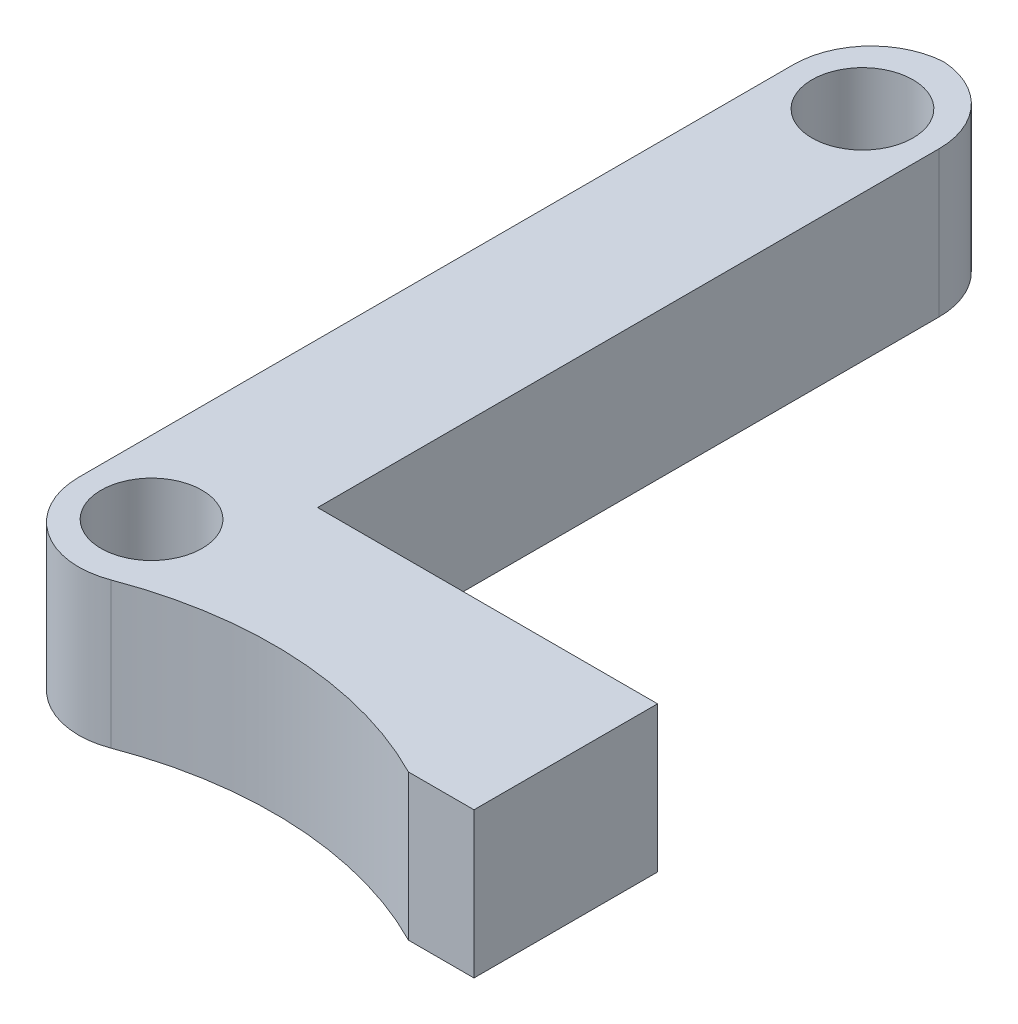
ISO-10303-21;
HEADER;
FILE_DESCRIPTION(('STEP AP214'),'2;1');
FILE_NAME('part.step','',(''),(''),'','','');
FILE_SCHEMA(('AUTOMOTIVE_DESIGN { 1 0 10303 214 1 1 1 1 }'));
ENDSEC;
DATA;
#1=APPLICATION_CONTEXT('core data for automotive mechanical design processes');
#2=APPLICATION_PROTOCOL_DEFINITION('international standard','automotive_design',2000,#1);
#3=PRODUCT_CONTEXT('',#1,'mechanical');
#4=PRODUCT('Part','Part','',(#3));
#5=PRODUCT_RELATED_PRODUCT_CATEGORY('part','',(#4));
#6=PRODUCT_DEFINITION_FORMATION('','',#4);
#7=PRODUCT_DEFINITION_CONTEXT('part definition',#1,'design');
#8=PRODUCT_DEFINITION('design','',#6,#7);
#9=PRODUCT_DEFINITION_SHAPE('','',#8);
#10=(LENGTH_UNIT() NAMED_UNIT(*) SI_UNIT(.MILLI.,.METRE.));
#11=(NAMED_UNIT(*) PLANE_ANGLE_UNIT() SI_UNIT($,.RADIAN.));
#12=(NAMED_UNIT(*) SI_UNIT($,.STERADIAN.) SOLID_ANGLE_UNIT());
#13=UNCERTAINTY_MEASURE_WITH_UNIT(LENGTH_MEASURE(1.E-05),#10,'distance_accuracy_value','');
#14=(GEOMETRIC_REPRESENTATION_CONTEXT(3) GLOBAL_UNCERTAINTY_ASSIGNED_CONTEXT((#13)) GLOBAL_UNIT_ASSIGNED_CONTEXT((#10,
#11,#12)) REPRESENTATION_CONTEXT('',''));
#15=CARTESIAN_POINT('',(0.,0.,0.));
#16=DIRECTION('',(0.,0.,1.));
#17=DIRECTION('',(1.,0.,0.));
#18=AXIS2_PLACEMENT_3D('',#15,#16,#17);
#19=CARTESIAN_POINT('',(11.1125,9.525,51.7475692889851));
#20=DIRECTION('',(0.,-1.,0.));
#21=DIRECTION('',(0.,0.,-1.));
#22=AXIS2_PLACEMENT_3D('',#19,#20,#21);
#23=PLANE('',#22);
#24=DIRECTION('',(0.,0.,1.));
#25=VECTOR('',#24,1.);
#26=CARTESIAN_POINT('',(-4.7625,9.525,-28.575));
#27=LINE('',#26,#25);
#28=CARTESIAN_POINT('',(-4.7625,9.525,-23.495));
#29=VERTEX_POINT('',#28);
#30=CARTESIAN_POINT('',(-4.7625,9.525,23.2432121659066));
#31=VERTEX_POINT('',#30);
#32=EDGE_CURVE('E123',#29,#31,#27,.T.);
#33=ORIENTED_EDGE('',*,*,#32,.T.);
#34=CARTESIAN_POINT('',(0.317500000000007,9.525,23.2432121659066));
#35=DIRECTION('',(0.,-1.,0.));
#36=DIRECTION('',(0.,0.,-1.));
#37=AXIS2_PLACEMENT_3D('',#34,#35,#36);
#38=CIRCLE('',#37,5.08);
#39=CARTESIAN_POINT('',(2.11666666666666,9.525,27.9939383530863));
#40=VERTEX_POINT('',#39);
#41=EDGE_CURVE('E11',#31,#40,#38,.F.);
#42=ORIENTED_EDGE('',*,*,#41,.T.);
#43=CARTESIAN_POINT('',(11.1125,9.525,51.7475692889851));
#44=DIRECTION('',(0.,-1.,0.));
#45=DIRECTION('',(0.,0.,-1.));
#46=AXIS2_PLACEMENT_3D('',#43,#44,#45);
#47=CIRCLE('',#46,25.4);
#48=CARTESIAN_POINT('',(22.7035166506002,9.525,29.1465));
#49=VERTEX_POINT('',#48);
#50=EDGE_CURVE('E182',#40,#49,#47,.T.);
#51=ORIENTED_EDGE('',*,*,#50,.T.);
#52=DIRECTION('',(1.,0.,0.));
#53=VECTOR('',#52,1.);
#54=CARTESIAN_POINT('',(26.9875,9.525,29.1465));
#55=LINE('',#54,#53);
#56=CARTESIAN_POINT('',(26.9875,9.525,29.1465));
#57=VERTEX_POINT('',#56);
#58=EDGE_CURVE('E222',#49,#57,#55,.T.);
#59=ORIENTED_EDGE('',*,*,#58,.T.);
#60=DIRECTION('',(0.,0.,-1.));
#61=VECTOR('',#60,1.);
#62=CARTESIAN_POINT('',(26.9875,9.525,17.145));
#63=LINE('',#62,#61);
#64=CARTESIAN_POINT('',(26.9875,9.525,17.145));
#65=VERTEX_POINT('',#64);
#66=EDGE_CURVE('E129',#57,#65,#63,.T.);
#67=ORIENTED_EDGE('',*,*,#66,.T.);
#68=DIRECTION('',(-1.,0.,0.));
#69=VECTOR('',#68,1.);
#70=CARTESIAN_POINT('',(4.76250000000001,9.525,17.145));
#71=LINE('',#70,#69);
#72=CARTESIAN_POINT('',(4.76250000000001,9.525,17.145));
#73=VERTEX_POINT('',#72);
#74=EDGE_CURVE('E124',#65,#73,#71,.T.);
#75=ORIENTED_EDGE('',*,*,#74,.T.);
#76=DIRECTION('',(0.,0.,-1.));
#77=VECTOR('',#76,1.);
#78=CARTESIAN_POINT('',(4.7625,9.525,-28.575));
#79=LINE('',#78,#77);
#80=CARTESIAN_POINT('',(4.7625,9.525,-23.495));
#81=VERTEX_POINT('',#80);
#82=EDGE_CURVE('E112',#73,#81,#79,.T.);
#83=ORIENTED_EDGE('',*,*,#82,.T.);
#84=CARTESIAN_POINT('',(-0.3175,9.525,-23.495));
#85=DIRECTION('',(0.,-1.,0.));
#86=DIRECTION('',(0.,0.,-1.));
#87=AXIS2_PLACEMENT_3D('',#84,#85,#86);
#88=CIRCLE('',#87,5.08);
#89=CARTESIAN_POINT('',(0.,9.525,-28.5650684166981));
#90=VERTEX_POINT('',#89);
#91=EDGE_CURVE('E159',#81,#90,#88,.F.);
#92=ORIENTED_EDGE('',*,*,#91,.T.);
#93=CARTESIAN_POINT('',(0.317499999999997,9.525,-23.495));
#94=DIRECTION('',(0.,-1.,0.));
#95=DIRECTION('',(0.,0.,-1.));
#96=AXIS2_PLACEMENT_3D('',#93,#94,#95);
#97=CIRCLE('',#96,5.08);
#98=EDGE_CURVE('E156',#90,#29,#97,.F.);
#99=ORIENTED_EDGE('',*,*,#98,.T.);
#100=EDGE_LOOP('',(#33,#42,#51,#59,#67,#75,#83,#92,#99));
#101=FACE_BOUND('',#100,.T.);
#102=CARTESIAN_POINT('',(0.,9.525,23.241));
#103=DIRECTION('',(0.,1.,0.));
#104=DIRECTION('',(0.,0.,1.));
#105=AXIS2_PLACEMENT_3D('',#102,#103,#104);
#106=CIRCLE('',#105,3.302);
#107=CARTESIAN_POINT('',(0.,9.525,19.939));
#108=VERTEX_POINT('',#107);
#109=EDGE_CURVE('E212',#108,#108,#106,.T.);
#110=ORIENTED_EDGE('',*,*,#109,.F.);
#111=EDGE_LOOP('',(#110));
#112=FACE_BOUND('',#111,.T.);
#113=CARTESIAN_POINT('',(0.,9.525,-23.241));
#114=DIRECTION('',(0.,1.,0.));
#115=DIRECTION('',(0.,0.,1.));
#116=AXIS2_PLACEMENT_3D('',#113,#114,#115);
#117=CIRCLE('',#116,3.302);
#118=CARTESIAN_POINT('',(0.,9.525,-26.543));
#119=VERTEX_POINT('',#118);
#120=EDGE_CURVE('E231',#119,#119,#117,.T.);
#121=ORIENTED_EDGE('',*,*,#120,.F.);
#122=EDGE_LOOP('',(#121));
#123=FACE_BOUND('',#122,.T.);
#124=ADVANCED_FACE('F39',(#101,#112,#123),#23,.F.);
#125=CARTESIAN_POINT('',(11.1125,0.,51.7475692889851));
#126=DIRECTION('',(0.,-1.,0.));
#127=DIRECTION('',(0.,0.,-1.));
#128=AXIS2_PLACEMENT_3D('',#125,#126,#127);
#129=PLANE('',#128);
#130=CARTESIAN_POINT('',(0.,0.,23.241));
#131=DIRECTION('',(0.,1.,0.));
#132=DIRECTION('',(0.,0.,1.));
#133=AXIS2_PLACEMENT_3D('',#130,#131,#132);
#134=CIRCLE('',#133,3.302);
#135=CARTESIAN_POINT('',(0.,0.,19.939));
#136=VERTEX_POINT('',#135);
#137=EDGE_CURVE('E217',#136,#136,#134,.T.);
#138=ORIENTED_EDGE('',*,*,#137,.T.);
#139=EDGE_LOOP('',(#138));
#140=FACE_BOUND('',#139,.T.);
#141=CARTESIAN_POINT('',(11.1125,0.,51.7475692889851));
#142=DIRECTION('',(0.,-1.,0.));
#143=DIRECTION('',(0.,0.,-1.));
#144=AXIS2_PLACEMENT_3D('',#141,#142,#143);
#145=CIRCLE('',#144,25.4);
#146=CARTESIAN_POINT('',(2.11666666666666,0.,27.9939383530863));
#147=VERTEX_POINT('',#146);
#148=CARTESIAN_POINT('',(22.7035166506002,0.,29.1465));
#149=VERTEX_POINT('',#148);
#150=EDGE_CURVE('E181',#147,#149,#145,.T.);
#151=ORIENTED_EDGE('',*,*,#150,.F.);
#152=CARTESIAN_POINT('',(0.317500000000007,0.,23.2432121659066));
#153=DIRECTION('',(0.,-1.,0.));
#154=DIRECTION('',(0.,0.,-1.));
#155=AXIS2_PLACEMENT_3D('',#152,#153,#154);
#156=CIRCLE('',#155,5.08);
#157=CARTESIAN_POINT('',(-4.7625,0.,23.2432121659066));
#158=VERTEX_POINT('',#157);
#159=EDGE_CURVE('E62',#147,#158,#156,.T.);
#160=ORIENTED_EDGE('',*,*,#159,.T.);
#161=DIRECTION('',(0.,0.,1.));
#162=VECTOR('',#161,1.);
#163=CARTESIAN_POINT('',(-4.7625,0.,-28.575));
#164=LINE('',#163,#162);
#165=CARTESIAN_POINT('',(-4.7625,0.,-23.495));
#166=VERTEX_POINT('',#165);
#167=EDGE_CURVE('E191',#166,#158,#164,.T.);
#168=ORIENTED_EDGE('',*,*,#167,.F.);
#169=CARTESIAN_POINT('',(0.317499999999997,0.,-23.495));
#170=DIRECTION('',(0.,-1.,0.));
#171=DIRECTION('',(0.,0.,-1.));
#172=AXIS2_PLACEMENT_3D('',#169,#170,#171);
#173=CIRCLE('',#172,5.08);
#174=CARTESIAN_POINT('',(0.,0.,-28.5650684166981));
#175=VERTEX_POINT('',#174);
#176=EDGE_CURVE('E140',#166,#175,#173,.T.);
#177=ORIENTED_EDGE('',*,*,#176,.T.);
#178=CARTESIAN_POINT('',(-0.3175,0.,-23.495));
#179=DIRECTION('',(0.,-1.,0.));
#180=DIRECTION('',(0.,0.,-1.));
#181=AXIS2_PLACEMENT_3D('',#178,#179,#180);
#182=CIRCLE('',#181,5.08);
#183=CARTESIAN_POINT('',(4.7625,0.,-23.495));
#184=VERTEX_POINT('',#183);
#185=EDGE_CURVE('E145',#175,#184,#182,.T.);
#186=ORIENTED_EDGE('',*,*,#185,.T.);
#187=DIRECTION('',(0.,0.,-1.));
#188=VECTOR('',#187,1.);
#189=CARTESIAN_POINT('',(4.7625,0.,-28.575));
#190=LINE('',#189,#188);
#191=CARTESIAN_POINT('',(4.76250000000001,0.,17.145));
#192=VERTEX_POINT('',#191);
#193=EDGE_CURVE('E196',#192,#184,#190,.T.);
#194=ORIENTED_EDGE('',*,*,#193,.F.);
#195=DIRECTION('',(-1.,0.,0.));
#196=VECTOR('',#195,1.);
#197=CARTESIAN_POINT('',(4.76250000000001,0.,17.145));
#198=LINE('',#197,#196);
#199=CARTESIAN_POINT('',(26.9875,0.,17.145));
#200=VERTEX_POINT('',#199);
#201=EDGE_CURVE('E138',#200,#192,#198,.T.);
#202=ORIENTED_EDGE('',*,*,#201,.F.);
#203=DIRECTION('',(0.,0.,-1.));
#204=VECTOR('',#203,1.);
#205=CARTESIAN_POINT('',(26.9875,0.,17.145));
#206=LINE('',#205,#204);
#207=CARTESIAN_POINT('',(26.9875,0.,29.1465));
#208=VERTEX_POINT('',#207);
#209=EDGE_CURVE('E134',#208,#200,#206,.T.);
#210=ORIENTED_EDGE('',*,*,#209,.F.);
#211=DIRECTION('',(1.,0.,0.));
#212=VECTOR('',#211,1.);
#213=CARTESIAN_POINT('',(26.9875,0.,29.1465));
#214=LINE('',#213,#212);
#215=EDGE_CURVE('E189',#149,#208,#214,.T.);
#216=ORIENTED_EDGE('',*,*,#215,.F.);
#217=EDGE_LOOP('',(#151,#160,#168,#177,#186,#194,#202,#210,#216));
#218=FACE_BOUND('',#217,.T.);
#219=CARTESIAN_POINT('',(0.,0.,-23.241));
#220=DIRECTION('',(0.,1.,0.));
#221=DIRECTION('',(0.,0.,1.));
#222=AXIS2_PLACEMENT_3D('',#219,#220,#221);
#223=CIRCLE('',#222,3.302);
#224=CARTESIAN_POINT('',(0.,0.,-26.543));
#225=VERTEX_POINT('',#224);
#226=EDGE_CURVE('E170',#225,#225,#223,.T.);
#227=ORIENTED_EDGE('',*,*,#226,.T.);
#228=EDGE_LOOP('',(#227));
#229=FACE_BOUND('',#228,.T.);
#230=ADVANCED_FACE('F186',(#140,#218,#229),#129,.T.);
#231=CARTESIAN_POINT('',(4.76250000000001,9.525,17.145));
#232=DIRECTION('',(0.,0.,1.));
#233=DIRECTION('',(1.,0.,0.));
#234=AXIS2_PLACEMENT_3D('',#231,#232,#233);
#235=PLANE('',#234);
#236=ORIENTED_EDGE('',*,*,#201,.T.);
#237=DIRECTION('',(0.,-1.,0.));
#238=VECTOR('',#237,1.);
#239=CARTESIAN_POINT('',(4.76250000000001,9.525,17.145));
#240=LINE('',#239,#238);
#241=EDGE_CURVE('E117',#73,#192,#240,.T.);
#242=ORIENTED_EDGE('',*,*,#241,.F.);
#243=ORIENTED_EDGE('',*,*,#74,.F.);
#244=DIRECTION('',(0.,-1.,0.));
#245=VECTOR('',#244,1.);
#246=CARTESIAN_POINT('',(26.9875,9.525,17.145));
#247=LINE('',#246,#245);
#248=EDGE_CURVE('E202',#65,#200,#247,.T.);
#249=ORIENTED_EDGE('',*,*,#248,.T.);
#250=EDGE_LOOP('',(#236,#242,#243,#249));
#251=FACE_BOUND('',#250,.T.);
#252=ADVANCED_FACE('F136',(#251),#235,.F.);
#253=CARTESIAN_POINT('',(4.7625,9.525,-28.575));
#254=DIRECTION('',(-1.,0.,0.));
#255=DIRECTION('',(0.,0.,1.));
#256=AXIS2_PLACEMENT_3D('',#253,#254,#255);
#257=PLANE('',#256);
#258=ORIENTED_EDGE('',*,*,#193,.T.);
#259=DIRECTION('',(0.,-1.,0.));
#260=VECTOR('',#259,1.);
#261=CARTESIAN_POINT('',(4.7625,9.525,-23.495));
#262=LINE('',#261,#260);
#263=EDGE_CURVE('E120',#184,#81,#262,.F.);
#264=ORIENTED_EDGE('',*,*,#263,.T.);
#265=ORIENTED_EDGE('',*,*,#82,.F.);
#266=ORIENTED_EDGE('',*,*,#241,.T.);
#267=EDGE_LOOP('',(#258,#264,#265,#266));
#268=FACE_BOUND('',#267,.T.);
#269=ADVANCED_FACE('F115',(#268),#257,.F.);
#270=CARTESIAN_POINT('',(-4.7625,9.525,-28.575));
#271=DIRECTION('',(1.,0.,0.));
#272=DIRECTION('',(0.,0.,-1.));
#273=AXIS2_PLACEMENT_3D('',#270,#271,#272);
#274=PLANE('',#273);
#275=ORIENTED_EDGE('',*,*,#167,.T.);
#276=DIRECTION('',(0.,-1.,0.));
#277=VECTOR('',#276,1.);
#278=CARTESIAN_POINT('',(-4.7625,9.525,23.2432121659066));
#279=LINE('',#278,#277);
#280=EDGE_CURVE('E48',#158,#31,#279,.F.);
#281=ORIENTED_EDGE('',*,*,#280,.T.);
#282=ORIENTED_EDGE('',*,*,#32,.F.);
#283=DIRECTION('',(0.,-1.,0.));
#284=VECTOR('',#283,1.);
#285=CARTESIAN_POINT('',(-4.7625,9.525,-23.495));
#286=LINE('',#285,#284);
#287=EDGE_CURVE('E162',#29,#166,#286,.T.);
#288=ORIENTED_EDGE('',*,*,#287,.T.);
#289=EDGE_LOOP('',(#275,#281,#282,#288));
#290=FACE_BOUND('',#289,.T.);
#291=ADVANCED_FACE('F261',(#290),#274,.F.);
#292=CARTESIAN_POINT('',(11.1125,9.525,51.7475692889851));
#293=DIRECTION('',(0.,-1.,0.));
#294=DIRECTION('',(0.,0.,-1.));
#295=AXIS2_PLACEMENT_3D('',#292,#293,#294);
#296=CYLINDRICAL_SURFACE('',#295,25.4);
#297=ORIENTED_EDGE('',*,*,#50,.F.);
#298=DIRECTION('',(0.,-1.,0.));
#299=VECTOR('',#298,1.);
#300=CARTESIAN_POINT('',(2.11666666666667,9.525,27.9939383530863));
#301=LINE('',#300,#299);
#302=EDGE_CURVE('E165',#40,#147,#301,.T.);
#303=ORIENTED_EDGE('',*,*,#302,.T.);
#304=ORIENTED_EDGE('',*,*,#150,.T.);
#305=DIRECTION('',(0.,-1.,0.));
#306=VECTOR('',#305,1.);
#307=CARTESIAN_POINT('',(22.7035166506002,9.525,29.1465));
#308=LINE('',#307,#306);
#309=EDGE_CURVE('E141',#49,#149,#308,.T.);
#310=ORIENTED_EDGE('',*,*,#309,.F.);
#311=EDGE_LOOP('',(#297,#303,#304,#310));
#312=FACE_BOUND('',#311,.T.);
#313=ADVANCED_FACE('F179',(#312),#296,.F.);
#314=CARTESIAN_POINT('',(26.9875,9.525,29.1465));
#315=DIRECTION('',(0.,0.,-1.));
#316=DIRECTION('',(-1.,0.,0.));
#317=AXIS2_PLACEMENT_3D('',#314,#315,#316);
#318=PLANE('',#317);
#319=ORIENTED_EDGE('',*,*,#215,.T.);
#320=DIRECTION('',(0.,-1.,0.));
#321=VECTOR('',#320,1.);
#322=CARTESIAN_POINT('',(26.9875,9.525,29.1465));
#323=LINE('',#322,#321);
#324=EDGE_CURVE('E148',#57,#208,#323,.T.);
#325=ORIENTED_EDGE('',*,*,#324,.F.);
#326=ORIENTED_EDGE('',*,*,#58,.F.);
#327=ORIENTED_EDGE('',*,*,#309,.T.);
#328=EDGE_LOOP('',(#319,#325,#326,#327));
#329=FACE_BOUND('',#328,.T.);
#330=ADVANCED_FACE('F256',(#329),#318,.F.);
#331=CARTESIAN_POINT('',(26.9875,9.525,17.145));
#332=DIRECTION('',(-1.,0.,0.));
#333=DIRECTION('',(0.,0.,1.));
#334=AXIS2_PLACEMENT_3D('',#331,#332,#333);
#335=PLANE('',#334);
#336=ORIENTED_EDGE('',*,*,#209,.T.);
#337=ORIENTED_EDGE('',*,*,#248,.F.);
#338=ORIENTED_EDGE('',*,*,#66,.F.);
#339=ORIENTED_EDGE('',*,*,#324,.T.);
#340=EDGE_LOOP('',(#336,#337,#338,#339));
#341=FACE_BOUND('',#340,.T.);
#342=ADVANCED_FACE('F208',(#341),#335,.F.);
#343=CARTESIAN_POINT('',(0.,9.525,23.241));
#344=DIRECTION('',(0.,-1.,0.));
#345=DIRECTION('',(0.,0.,-1.));
#346=AXIS2_PLACEMENT_3D('',#343,#344,#345);
#347=CYLINDRICAL_SURFACE('',#346,3.302);
#348=CARTESIAN_POINT('',(0.,9.525,19.939));
#349=CARTESIAN_POINT('',(0.,9.42578125,19.939));
#350=CARTESIAN_POINT('',(0.,9.3265625,19.939));
#351=CARTESIAN_POINT('',(0.,9.128125,19.939));
#352=CARTESIAN_POINT('',(0.,9.02890625,19.939));
#353=CARTESIAN_POINT('',(0.,8.83046875,19.939));
#354=CARTESIAN_POINT('',(0.,8.73125,19.939));
#355=CARTESIAN_POINT('',(0.,8.5328125,19.939));
#356=CARTESIAN_POINT('',(0.,8.43359375,19.939));
#357=CARTESIAN_POINT('',(0.,8.23515625,19.939));
#358=CARTESIAN_POINT('',(0.,8.1359375,19.939));
#359=CARTESIAN_POINT('',(0.,7.9375,19.939));
#360=CARTESIAN_POINT('',(0.,7.83828125,19.939));
#361=CARTESIAN_POINT('',(0.,7.63984375,19.939));
#362=CARTESIAN_POINT('',(0.,7.540625,19.939));
#363=CARTESIAN_POINT('',(0.,7.3421875,19.939));
#364=CARTESIAN_POINT('',(0.,7.24296875,19.939));
#365=CARTESIAN_POINT('',(0.,7.04453125,19.939));
#366=CARTESIAN_POINT('',(0.,6.9453125,19.939));
#367=CARTESIAN_POINT('',(0.,6.746875,19.939));
#368=CARTESIAN_POINT('',(0.,6.64765625,19.939));
#369=CARTESIAN_POINT('',(0.,6.44921875,19.939));
#370=CARTESIAN_POINT('',(0.,6.35,19.939));
#371=CARTESIAN_POINT('',(0.,6.1515625,19.939));
#372=CARTESIAN_POINT('',(0.,6.05234375,19.939));
#373=CARTESIAN_POINT('',(0.,5.85390625,19.939));
#374=CARTESIAN_POINT('',(0.,5.7546875,19.939));
#375=CARTESIAN_POINT('',(0.,5.55625,19.939));
#376=CARTESIAN_POINT('',(0.,5.45703125,19.939));
#377=CARTESIAN_POINT('',(0.,5.25859375,19.939));
#378=CARTESIAN_POINT('',(0.,5.159375,19.939));
#379=CARTESIAN_POINT('',(0.,4.9609375,19.939));
#380=CARTESIAN_POINT('',(0.,4.86171875,19.939));
#381=CARTESIAN_POINT('',(0.,4.66328125,19.939));
#382=CARTESIAN_POINT('',(0.,4.5640625,19.939));
#383=CARTESIAN_POINT('',(0.,4.365625,19.939));
#384=CARTESIAN_POINT('',(0.,4.26640625,19.939));
#385=CARTESIAN_POINT('',(0.,4.06796875,19.939));
#386=CARTESIAN_POINT('',(0.,3.96875,19.939));
#387=CARTESIAN_POINT('',(0.,3.7703125,19.939));
#388=CARTESIAN_POINT('',(0.,3.67109375,19.939));
#389=CARTESIAN_POINT('',(0.,3.47265625,19.939));
#390=CARTESIAN_POINT('',(0.,3.3734375,19.939));
#391=CARTESIAN_POINT('',(0.,3.175,19.939));
#392=CARTESIAN_POINT('',(0.,3.07578125,19.939));
#393=CARTESIAN_POINT('',(0.,2.87734375,19.939));
#394=CARTESIAN_POINT('',(0.,2.778125,19.939));
#395=CARTESIAN_POINT('',(0.,2.5796875,19.939));
#396=CARTESIAN_POINT('',(0.,2.48046875,19.939));
#397=CARTESIAN_POINT('',(0.,2.28203125,19.939));
#398=CARTESIAN_POINT('',(0.,2.1828125,19.939));
#399=CARTESIAN_POINT('',(0.,1.984375,19.939));
#400=CARTESIAN_POINT('',(0.,1.88515625,19.939));
#401=CARTESIAN_POINT('',(0.,1.68671875,19.939));
#402=CARTESIAN_POINT('',(0.,1.5875,19.939));
#403=CARTESIAN_POINT('',(0.,1.3890625,19.939));
#404=CARTESIAN_POINT('',(0.,1.28984375,19.939));
#405=CARTESIAN_POINT('',(0.,1.09140625,19.939));
#406=CARTESIAN_POINT('',(0.,0.992187500000001,19.939));
#407=CARTESIAN_POINT('',(0.,0.793750000000001,19.939));
#408=CARTESIAN_POINT('',(0.,0.69453125,19.939));
#409=CARTESIAN_POINT('',(0.,0.49609375,19.939));
#410=CARTESIAN_POINT('',(0.,0.396875,19.939));
#411=CARTESIAN_POINT('',(0.,0.1984375,19.939));
#412=CARTESIAN_POINT('',(0.,0.0992187500000001,19.939));
#413=CARTESIAN_POINT('',(0.,0.,19.939));
#414=B_SPLINE_CURVE_WITH_KNOTS('',3,(#348,#349,#350,#351,#352,#353,#354,#355,#356,#357,#358,
#359,#360,#361,#362,#363,#364,#365,#366,#367,#368,#369,#370,#371,#372,#373,#374,#375,#376,#377,
#378,#379,#380,#381,#382,#383,#384,#385,#386,#387,#388,#389,#390,#391,#392,#393,#394,#395,#396,
#397,#398,#399,#400,#401,#402,#403,#404,#405,#406,#407,#408,#409,#410,#411,#412,#413),
.UNSPECIFIED.,.F.,.F.,(4,2,2,2,2,2,2,2,2,2,2,2,2,2,2,2,2,2,2,2,2,2,2,2,2,2,2,2,2,2,2,2,4),(0.,
0.297656249999998,0.595312499999999,0.892968749999999,1.190625,1.48828125,1.7859375,2.08359375,
2.38125,2.67890625,2.9765625,3.27421875,3.571875,3.86953125,4.1671875,4.46484375,4.7625,
5.06015625,5.3578125,5.65546875,5.953125,6.25078125,6.5484375,6.84609375,7.14375,7.44140625,
7.7390625,8.03671875,8.334375,8.63203125,8.9296875,9.22734375,9.525),.UNSPECIFIED.);
#415=EDGE_CURVE('BSEAM251',#108,#136,#414,.T.);
#416=ORIENTED_EDGE('',*,*,#109,.T.);
#417=ORIENTED_EDGE('',*,*,#137,.F.);
#418=ORIENTED_EDGE('',*,*,#415,.T.);
#419=ORIENTED_EDGE('',*,*,#415,.F.);
#420=EDGE_LOOP('',(#416,#418,#417,#419));
#421=FACE_BOUND('',#420,.T.);
#422=ADVANCED_FACE('F251',(#421),#347,.F.);
#423=CARTESIAN_POINT('',(0.,9.525,-23.241));
#424=DIRECTION('',(0.,-1.,0.));
#425=DIRECTION('',(0.,0.,-1.));
#426=AXIS2_PLACEMENT_3D('',#423,#424,#425);
#427=CYLINDRICAL_SURFACE('',#426,3.302);
#428=CARTESIAN_POINT('',(0.,9.525,-26.543));
#429=CARTESIAN_POINT('',(0.,9.42578125,-26.543));
#430=CARTESIAN_POINT('',(0.,9.3265625,-26.543));
#431=CARTESIAN_POINT('',(0.,9.128125,-26.543));
#432=CARTESIAN_POINT('',(0.,9.02890625,-26.543));
#433=CARTESIAN_POINT('',(0.,8.83046875,-26.543));
#434=CARTESIAN_POINT('',(0.,8.73125,-26.543));
#435=CARTESIAN_POINT('',(0.,8.5328125,-26.543));
#436=CARTESIAN_POINT('',(0.,8.43359375,-26.543));
#437=CARTESIAN_POINT('',(0.,8.23515625,-26.543));
#438=CARTESIAN_POINT('',(0.,8.1359375,-26.543));
#439=CARTESIAN_POINT('',(0.,7.9375,-26.543));
#440=CARTESIAN_POINT('',(0.,7.83828125,-26.543));
#441=CARTESIAN_POINT('',(0.,7.63984375,-26.543));
#442=CARTESIAN_POINT('',(0.,7.540625,-26.543));
#443=CARTESIAN_POINT('',(0.,7.3421875,-26.543));
#444=CARTESIAN_POINT('',(0.,7.24296875,-26.543));
#445=CARTESIAN_POINT('',(0.,7.04453125,-26.543));
#446=CARTESIAN_POINT('',(0.,6.9453125,-26.543));
#447=CARTESIAN_POINT('',(0.,6.746875,-26.543));
#448=CARTESIAN_POINT('',(0.,6.64765625,-26.543));
#449=CARTESIAN_POINT('',(0.,6.44921875,-26.543));
#450=CARTESIAN_POINT('',(0.,6.35,-26.543));
#451=CARTESIAN_POINT('',(0.,6.1515625,-26.543));
#452=CARTESIAN_POINT('',(0.,6.05234375,-26.543));
#453=CARTESIAN_POINT('',(0.,5.85390625,-26.543));
#454=CARTESIAN_POINT('',(0.,5.7546875,-26.543));
#455=CARTESIAN_POINT('',(0.,5.55625,-26.543));
#456=CARTESIAN_POINT('',(0.,5.45703125,-26.543));
#457=CARTESIAN_POINT('',(0.,5.25859375,-26.543));
#458=CARTESIAN_POINT('',(0.,5.159375,-26.543));
#459=CARTESIAN_POINT('',(0.,4.9609375,-26.543));
#460=CARTESIAN_POINT('',(0.,4.86171875,-26.543));
#461=CARTESIAN_POINT('',(0.,4.66328125,-26.543));
#462=CARTESIAN_POINT('',(0.,4.5640625,-26.543));
#463=CARTESIAN_POINT('',(0.,4.365625,-26.543));
#464=CARTESIAN_POINT('',(0.,4.26640625,-26.543));
#465=CARTESIAN_POINT('',(0.,4.06796875,-26.543));
#466=CARTESIAN_POINT('',(0.,3.96875,-26.543));
#467=CARTESIAN_POINT('',(0.,3.7703125,-26.543));
#468=CARTESIAN_POINT('',(0.,3.67109375,-26.543));
#469=CARTESIAN_POINT('',(0.,3.47265625,-26.543));
#470=CARTESIAN_POINT('',(0.,3.3734375,-26.543));
#471=CARTESIAN_POINT('',(0.,3.175,-26.543));
#472=CARTESIAN_POINT('',(0.,3.07578125,-26.543));
#473=CARTESIAN_POINT('',(0.,2.87734375,-26.543));
#474=CARTESIAN_POINT('',(0.,2.778125,-26.543));
#475=CARTESIAN_POINT('',(0.,2.5796875,-26.543));
#476=CARTESIAN_POINT('',(0.,2.48046875,-26.543));
#477=CARTESIAN_POINT('',(0.,2.28203125,-26.543));
#478=CARTESIAN_POINT('',(0.,2.1828125,-26.543));
#479=CARTESIAN_POINT('',(0.,1.984375,-26.543));
#480=CARTESIAN_POINT('',(0.,1.88515625,-26.543));
#481=CARTESIAN_POINT('',(0.,1.68671875,-26.543));
#482=CARTESIAN_POINT('',(0.,1.5875,-26.543));
#483=CARTESIAN_POINT('',(0.,1.3890625,-26.543));
#484=CARTESIAN_POINT('',(0.,1.28984375,-26.543));
#485=CARTESIAN_POINT('',(0.,1.09140625,-26.543));
#486=CARTESIAN_POINT('',(0.,0.992187500000001,-26.543));
#487=CARTESIAN_POINT('',(0.,0.793750000000001,-26.543));
#488=CARTESIAN_POINT('',(0.,0.69453125,-26.543));
#489=CARTESIAN_POINT('',(0.,0.49609375,-26.543));
#490=CARTESIAN_POINT('',(0.,0.396875,-26.543));
#491=CARTESIAN_POINT('',(0.,0.1984375,-26.543));
#492=CARTESIAN_POINT('',(0.,0.0992187500000001,-26.543));
#493=CARTESIAN_POINT('',(0.,0.,-26.543));
#494=B_SPLINE_CURVE_WITH_KNOTS('',3,(#428,#429,#430,#431,#432,#433,#434,#435,#436,#437,#438,
#439,#440,#441,#442,#443,#444,#445,#446,#447,#448,#449,#450,#451,#452,#453,#454,#455,#456,#457,
#458,#459,#460,#461,#462,#463,#464,#465,#466,#467,#468,#469,#470,#471,#472,#473,#474,#475,#476,
#477,#478,#479,#480,#481,#482,#483,#484,#485,#486,#487,#488,#489,#490,#491,#492,#493),
.UNSPECIFIED.,.F.,.F.,(4,2,2,2,2,2,2,2,2,2,2,2,2,2,2,2,2,2,2,2,2,2,2,2,2,2,2,2,2,2,2,2,4),(0.,
0.297656249999998,0.595312499999999,0.892968749999999,1.190625,1.48828125,1.7859375,2.08359375,
2.38125,2.67890625,2.9765625,3.27421875,3.571875,3.86953125,4.1671875,4.46484375,4.7625,
5.06015625,5.3578125,5.65546875,5.953125,6.25078125,6.5484375,6.84609375,7.14375,7.44140625,
7.7390625,8.03671875,8.334375,8.63203125,8.9296875,9.22734375,9.525),.UNSPECIFIED.);
#495=EDGE_CURVE('BSEAM240',#119,#225,#494,.T.);
#496=ORIENTED_EDGE('',*,*,#120,.T.);
#497=ORIENTED_EDGE('',*,*,#226,.F.);
#498=ORIENTED_EDGE('',*,*,#495,.T.);
#499=ORIENTED_EDGE('',*,*,#495,.F.);
#500=EDGE_LOOP('',(#496,#498,#497,#499));
#501=FACE_BOUND('',#500,.T.);
#502=ADVANCED_FACE('F240',(#501),#427,.F.);
#503=CARTESIAN_POINT('',(0.317499999999997,9.525,-23.495));
#504=DIRECTION('',(0.,-1.,0.));
#505=DIRECTION('',(0.,0.,-1.));
#506=AXIS2_PLACEMENT_3D('',#503,#504,#505);
#507=CYLINDRICAL_SURFACE('',#506,5.08);
#508=ORIENTED_EDGE('',*,*,#287,.F.);
#509=ORIENTED_EDGE('',*,*,#98,.F.);
#510=DIRECTION('',(0.,-1.,0.));
#511=VECTOR('',#510,1.);
#512=CARTESIAN_POINT('',(0.,4.7625,-28.5650684166981));
#513=LINE('',#512,#511);
#514=EDGE_CURVE('E166',#175,#90,#513,.F.);
#515=ORIENTED_EDGE('',*,*,#514,.F.);
#516=ORIENTED_EDGE('',*,*,#176,.F.);
#517=EDGE_LOOP('',(#508,#509,#515,#516));
#518=FACE_BOUND('',#517,.T.);
#519=ADVANCED_FACE('F270',(#518),#507,.T.);
#520=CARTESIAN_POINT('',(-0.3175,9.525,-23.495));
#521=DIRECTION('',(0.,-1.,0.));
#522=DIRECTION('',(0.,0.,-1.));
#523=AXIS2_PLACEMENT_3D('',#520,#521,#522);
#524=CYLINDRICAL_SURFACE('',#523,5.08);
#525=ORIENTED_EDGE('',*,*,#91,.F.);
#526=ORIENTED_EDGE('',*,*,#263,.F.);
#527=ORIENTED_EDGE('',*,*,#185,.F.);
#528=ORIENTED_EDGE('',*,*,#514,.T.);
#529=EDGE_LOOP('',(#525,#526,#527,#528));
#530=FACE_BOUND('',#529,.T.);
#531=ADVANCED_FACE('F268',(#530),#524,.T.);
#532=CARTESIAN_POINT('',(0.317500000000007,9.525,23.2432121659066));
#533=DIRECTION('',(0.,-1.,0.));
#534=DIRECTION('',(0.,0.,-1.));
#535=AXIS2_PLACEMENT_3D('',#532,#533,#534);
#536=CYLINDRICAL_SURFACE('',#535,5.08);
#537=ORIENTED_EDGE('',*,*,#41,.F.);
#538=ORIENTED_EDGE('',*,*,#280,.F.);
#539=ORIENTED_EDGE('',*,*,#159,.F.);
#540=ORIENTED_EDGE('',*,*,#302,.F.);
#541=EDGE_LOOP('',(#537,#538,#539,#540));
#542=FACE_BOUND('',#541,.T.);
#543=ADVANCED_FACE('F41',(#542),#536,.T.);
#544=CLOSED_SHELL('',(#124,#230,#252,#269,#291,#313,#330,#342,#422,#502,#519,#531,#543));
#545=MANIFOLD_SOLID_BREP('B2',#544);
#546=ADVANCED_BREP_SHAPE_REPRESENTATION('',(#18,#545),#14);
#547=SHAPE_DEFINITION_REPRESENTATION(#9,#546);
ENDSEC;
END-ISO-10303-21;
